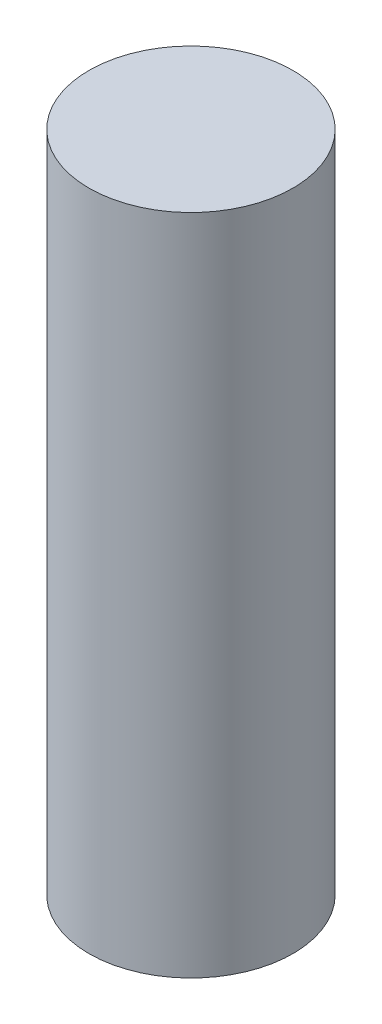
ISO-10303-21;
HEADER;
FILE_DESCRIPTION(('STEP AP214'),'2;1');
FILE_NAME('part.step','',(''),(''),'','','');
FILE_SCHEMA(('AUTOMOTIVE_DESIGN { 1 0 10303 214 1 1 1 1 }'));
ENDSEC;
DATA;
#1=APPLICATION_CONTEXT('core data for automotive mechanical design processes');
#2=APPLICATION_PROTOCOL_DEFINITION('international standard','automotive_design',2000,#1);
#3=PRODUCT_CONTEXT('',#1,'mechanical');
#4=PRODUCT('Part','Part','',(#3));
#5=PRODUCT_RELATED_PRODUCT_CATEGORY('part','',(#4));
#6=PRODUCT_DEFINITION_FORMATION('','',#4);
#7=PRODUCT_DEFINITION_CONTEXT('part definition',#1,'design');
#8=PRODUCT_DEFINITION('design','',#6,#7);
#9=PRODUCT_DEFINITION_SHAPE('','',#8);
#10=(LENGTH_UNIT() NAMED_UNIT(*) SI_UNIT(.MILLI.,.METRE.));
#11=(NAMED_UNIT(*) PLANE_ANGLE_UNIT() SI_UNIT($,.RADIAN.));
#12=(NAMED_UNIT(*) SI_UNIT($,.STERADIAN.) SOLID_ANGLE_UNIT());
#13=UNCERTAINTY_MEASURE_WITH_UNIT(LENGTH_MEASURE(1.E-05),#10,'distance_accuracy_value','');
#14=(GEOMETRIC_REPRESENTATION_CONTEXT(3) GLOBAL_UNCERTAINTY_ASSIGNED_CONTEXT((#13)) GLOBAL_UNIT_ASSIGNED_CONTEXT((#10,
#11,#12)) REPRESENTATION_CONTEXT('',''));
#15=CARTESIAN_POINT('',(0.,0.,0.));
#16=DIRECTION('',(0.,0.,1.));
#17=DIRECTION('',(1.,0.,0.));
#18=AXIS2_PLACEMENT_3D('',#15,#16,#17);
#19=CARTESIAN_POINT('',(0.,33.02,0.));
#20=DIRECTION('',(0.,-1.,0.));
#21=DIRECTION('',(0.,0.,-1.));
#22=AXIS2_PLACEMENT_3D('',#19,#20,#21);
#23=CYLINDRICAL_SURFACE('',#22,5.08);
#24=CARTESIAN_POINT('',(0.,33.02,0.));
#25=DIRECTION('',(0.,1.,0.));
#26=DIRECTION('',(0.,0.,1.));
#27=AXIS2_PLACEMENT_3D('',#24,#25,#26);
#28=CIRCLE('',#27,5.08);
#29=CARTESIAN_POINT('',(0.,33.02,5.08));
#30=VERTEX_POINT('',#29);
#31=EDGE_CURVE('E10',#30,#30,#28,.T.);
#32=ORIENTED_EDGE('',*,*,#31,.F.);
#33=EDGE_LOOP('',(#32));
#34=FACE_BOUND('',#33,.T.);
#35=CARTESIAN_POINT('',(0.,0.,0.));
#36=DIRECTION('',(0.,1.,0.));
#37=DIRECTION('',(0.,0.,1.));
#38=AXIS2_PLACEMENT_3D('',#35,#36,#37);
#39=CIRCLE('',#38,5.08);
#40=CARTESIAN_POINT('',(0.,0.,5.08));
#41=VERTEX_POINT('',#40);
#42=EDGE_CURVE('E40',#41,#41,#39,.T.);
#43=ORIENTED_EDGE('',*,*,#42,.T.);
#44=EDGE_LOOP('',(#43));
#45=FACE_BOUND('',#44,.T.);
#46=ADVANCED_FACE('F37',(#34,#45),#23,.T.);
#47=CARTESIAN_POINT('',(0.,33.02,0.));
#48=DIRECTION('',(0.,1.,0.));
#49=DIRECTION('',(0.,0.,1.));
#50=AXIS2_PLACEMENT_3D('',#47,#48,#49);
#51=PLANE('',#50);
#52=ORIENTED_EDGE('',*,*,#31,.T.);
#53=EDGE_LOOP('',(#52));
#54=FACE_BOUND('',#53,.T.);
#55=ADVANCED_FACE('F54',(#54),#51,.T.);
#56=CARTESIAN_POINT('',(0.,0.,0.));
#57=DIRECTION('',(0.,1.,0.));
#58=DIRECTION('',(0.,0.,1.));
#59=AXIS2_PLACEMENT_3D('',#56,#57,#58);
#60=PLANE('',#59);
#61=ORIENTED_EDGE('',*,*,#42,.F.);
#62=EDGE_LOOP('',(#61));
#63=FACE_BOUND('',#62,.T.);
#64=ADVANCED_FACE('F52',(#63),#60,.F.);
#65=CLOSED_SHELL('',(#46,#55,#64));
#66=MANIFOLD_SOLID_BREP('B2',#65);
#67=ADVANCED_BREP_SHAPE_REPRESENTATION('',(#18,#66),#14);
#68=SHAPE_DEFINITION_REPRESENTATION(#9,#67);
ENDSEC;
END-ISO-10303-21;
